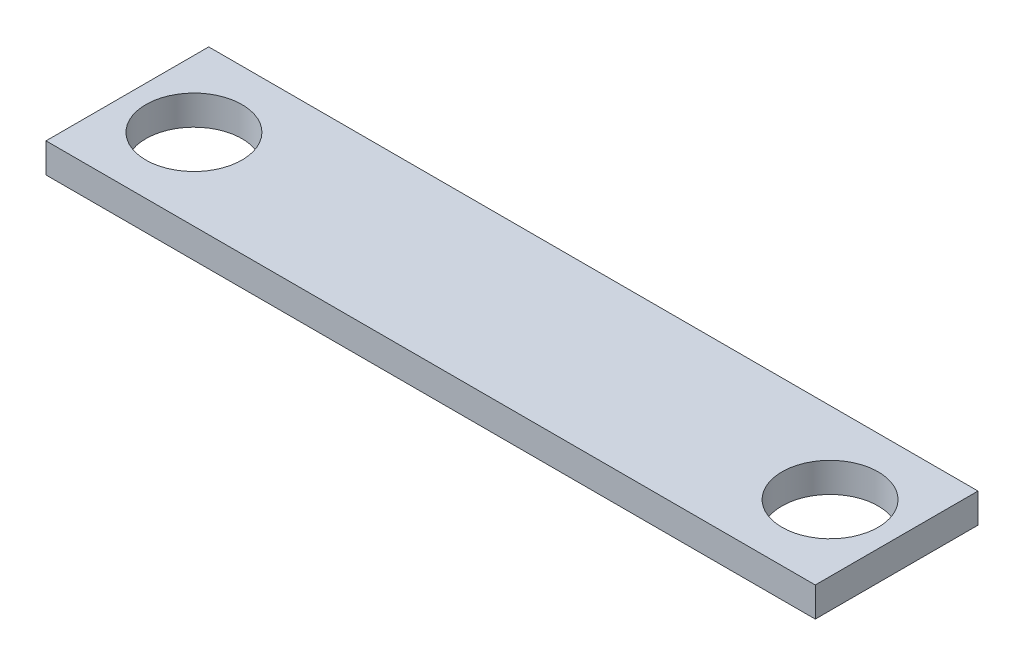
ISO-10303-21;
HEADER;
FILE_DESCRIPTION(('STEP AP214'),'2;1');
FILE_NAME('part.step','',(''),(''),'','','');
FILE_SCHEMA(('AUTOMOTIVE_DESIGN { 1 0 10303 214 1 1 1 1 }'));
ENDSEC;
DATA;
#1=APPLICATION_CONTEXT('core data for automotive mechanical design processes');
#2=APPLICATION_PROTOCOL_DEFINITION('international standard','automotive_design',2000,#1);
#3=PRODUCT_CONTEXT('',#1,'mechanical');
#4=PRODUCT('Part','Part','',(#3));
#5=PRODUCT_RELATED_PRODUCT_CATEGORY('part','',(#4));
#6=PRODUCT_DEFINITION_FORMATION('','',#4);
#7=PRODUCT_DEFINITION_CONTEXT('part definition',#1,'design');
#8=PRODUCT_DEFINITION('design','',#6,#7);
#9=PRODUCT_DEFINITION_SHAPE('','',#8);
#10=(LENGTH_UNIT() NAMED_UNIT(*) SI_UNIT(.MILLI.,.METRE.));
#11=(NAMED_UNIT(*) PLANE_ANGLE_UNIT() SI_UNIT($,.RADIAN.));
#12=(NAMED_UNIT(*) SI_UNIT($,.STERADIAN.) SOLID_ANGLE_UNIT());
#13=UNCERTAINTY_MEASURE_WITH_UNIT(LENGTH_MEASURE(1.E-05),#10,'distance_accuracy_value','');
#14=(GEOMETRIC_REPRESENTATION_CONTEXT(3) GLOBAL_UNCERTAINTY_ASSIGNED_CONTEXT((#13)) GLOBAL_UNIT_ASSIGNED_CONTEXT((#10,
#11,#12)) REPRESENTATION_CONTEXT('',''));
#15=CARTESIAN_POINT('',(0.,0.,0.));
#16=DIRECTION('',(0.,0.,1.));
#17=DIRECTION('',(1.,0.,0.));
#18=AXIS2_PLACEMENT_3D('',#15,#16,#17);
#19=CARTESIAN_POINT('',(0.,20.,0.));
#20=DIRECTION('',(0.,-1.,0.));
#21=DIRECTION('',(0.,0.,-1.));
#22=AXIS2_PLACEMENT_3D('',#19,#20,#21);
#23=PLANE('',#22);
#24=DIRECTION('',(0.,0.,-1.));
#25=VECTOR('',#24,1.);
#26=CARTESIAN_POINT('',(260.,20.,55.));
#27=LINE('',#26,#25);
#28=CARTESIAN_POINT('',(260.,20.,55.));
#29=VERTEX_POINT('',#28);
#30=CARTESIAN_POINT('',(260.,20.,-55.));
#31=VERTEX_POINT('',#30);
#32=EDGE_CURVE('E89',#29,#31,#27,.T.);
#33=ORIENTED_EDGE('',*,*,#32,.T.);
#34=DIRECTION('',(-1.,0.,0.));
#35=VECTOR('',#34,1.);
#36=CARTESIAN_POINT('',(-260.,20.,-55.));
#37=LINE('',#36,#35);
#38=CARTESIAN_POINT('',(-260.,20.,-55.));
#39=VERTEX_POINT('',#38);
#40=EDGE_CURVE('E84',#31,#39,#37,.T.);
#41=ORIENTED_EDGE('',*,*,#40,.T.);
#42=DIRECTION('',(0.,0.,1.));
#43=VECTOR('',#42,1.);
#44=CARTESIAN_POINT('',(-260.,20.,55.));
#45=LINE('',#44,#43);
#46=CARTESIAN_POINT('',(-260.,20.,55.));
#47=VERTEX_POINT('',#46);
#48=EDGE_CURVE('E87',#39,#47,#45,.T.);
#49=ORIENTED_EDGE('',*,*,#48,.T.);
#50=DIRECTION('',(1.,0.,0.));
#51=VECTOR('',#50,1.);
#52=CARTESIAN_POINT('',(-260.,20.,55.));
#53=LINE('',#52,#51);
#54=EDGE_CURVE('E54',#47,#29,#53,.T.);
#55=ORIENTED_EDGE('',*,*,#54,.T.);
#56=EDGE_LOOP('',(#33,#41,#49,#55));
#57=FACE_BOUND('',#56,.T.);
#58=CARTESIAN_POINT('',(-215.,20.,0.));
#59=DIRECTION('',(0.,1.,0.));
#60=DIRECTION('',(0.,0.,1.));
#61=AXIS2_PLACEMENT_3D('',#58,#59,#60);
#62=CIRCLE('',#61,32.5);
#63=CARTESIAN_POINT('',(-215.,20.,32.5));
#64=VERTEX_POINT('',#63);
#65=EDGE_CURVE('E104',#64,#64,#62,.T.);
#66=ORIENTED_EDGE('',*,*,#65,.F.);
#67=EDGE_LOOP('',(#66));
#68=FACE_BOUND('',#67,.T.);
#69=CARTESIAN_POINT('',(215.,20.,0.));
#70=DIRECTION('',(0.,1.,0.));
#71=DIRECTION('',(0.,0.,1.));
#72=AXIS2_PLACEMENT_3D('',#69,#70,#71);
#73=CIRCLE('',#72,32.5);
#74=CARTESIAN_POINT('',(215.,20.,32.5));
#75=VERTEX_POINT('',#74);
#76=EDGE_CURVE('E119',#75,#75,#73,.T.);
#77=ORIENTED_EDGE('',*,*,#76,.F.);
#78=EDGE_LOOP('',(#77));
#79=FACE_BOUND('',#78,.T.);
#80=ADVANCED_FACE('F37',(#57,#68,#79),#23,.F.);
#81=CARTESIAN_POINT('',(0.,0.,0.));
#82=DIRECTION('',(0.,-1.,0.));
#83=DIRECTION('',(0.,0.,-1.));
#84=AXIS2_PLACEMENT_3D('',#81,#82,#83);
#85=PLANE('',#84);
#86=CARTESIAN_POINT('',(-215.,0.,0.));
#87=DIRECTION('',(0.,1.,0.));
#88=DIRECTION('',(0.,0.,1.));
#89=AXIS2_PLACEMENT_3D('',#86,#87,#88);
#90=CIRCLE('',#89,32.5);
#91=CARTESIAN_POINT('',(-215.,0.,32.5));
#92=VERTEX_POINT('',#91);
#93=EDGE_CURVE('E116',#92,#92,#90,.T.);
#94=ORIENTED_EDGE('',*,*,#93,.T.);
#95=EDGE_LOOP('',(#94));
#96=FACE_BOUND('',#95,.T.);
#97=DIRECTION('',(0.,0.,-1.));
#98=VECTOR('',#97,1.);
#99=CARTESIAN_POINT('',(260.,0.,55.));
#100=LINE('',#99,#98);
#101=CARTESIAN_POINT('',(260.,0.,55.));
#102=VERTEX_POINT('',#101);
#103=CARTESIAN_POINT('',(260.,0.,-55.));
#104=VERTEX_POINT('',#103);
#105=EDGE_CURVE('E101',#102,#104,#100,.T.);
#106=ORIENTED_EDGE('',*,*,#105,.F.);
#107=DIRECTION('',(1.,0.,0.));
#108=VECTOR('',#107,1.);
#109=CARTESIAN_POINT('',(-260.,0.,55.));
#110=LINE('',#109,#108);
#111=CARTESIAN_POINT('',(-260.,0.,55.));
#112=VERTEX_POINT('',#111);
#113=EDGE_CURVE('E77',#112,#102,#110,.T.);
#114=ORIENTED_EDGE('',*,*,#113,.F.);
#115=DIRECTION('',(0.,0.,1.));
#116=VECTOR('',#115,1.);
#117=CARTESIAN_POINT('',(-260.,0.,55.));
#118=LINE('',#117,#116);
#119=CARTESIAN_POINT('',(-260.,0.,-55.));
#120=VERTEX_POINT('',#119);
#121=EDGE_CURVE('E71',#120,#112,#118,.T.);
#122=ORIENTED_EDGE('',*,*,#121,.F.);
#123=DIRECTION('',(-1.,0.,0.));
#124=VECTOR('',#123,1.);
#125=CARTESIAN_POINT('',(-260.,0.,-55.));
#126=LINE('',#125,#124);
#127=EDGE_CURVE('E93',#104,#120,#126,.T.);
#128=ORIENTED_EDGE('',*,*,#127,.F.);
#129=EDGE_LOOP('',(#106,#114,#122,#128));
#130=FACE_BOUND('',#129,.T.);
#131=CARTESIAN_POINT('',(215.,0.,0.));
#132=DIRECTION('',(0.,1.,0.));
#133=DIRECTION('',(0.,0.,1.));
#134=AXIS2_PLACEMENT_3D('',#131,#132,#133);
#135=CIRCLE('',#134,32.5);
#136=CARTESIAN_POINT('',(215.,0.,32.5));
#137=VERTEX_POINT('',#136);
#138=EDGE_CURVE('E122',#137,#137,#135,.T.);
#139=ORIENTED_EDGE('',*,*,#138,.T.);
#140=EDGE_LOOP('',(#139));
#141=FACE_BOUND('',#140,.T.);
#142=ADVANCED_FACE('F112',(#96,#130,#141),#85,.T.);
#143=CARTESIAN_POINT('',(260.,20.,55.));
#144=DIRECTION('',(-1.,0.,0.));
#145=DIRECTION('',(0.,0.,1.));
#146=AXIS2_PLACEMENT_3D('',#143,#144,#145);
#147=PLANE('',#146);
#148=ORIENTED_EDGE('',*,*,#105,.T.);
#149=DIRECTION('',(0.,-1.,0.));
#150=VECTOR('',#149,1.);
#151=CARTESIAN_POINT('',(260.,20.,-55.));
#152=LINE('',#151,#150);
#153=EDGE_CURVE('E11',#31,#104,#152,.T.);
#154=ORIENTED_EDGE('',*,*,#153,.F.);
#155=ORIENTED_EDGE('',*,*,#32,.F.);
#156=DIRECTION('',(0.,-1.,0.));
#157=VECTOR('',#156,1.);
#158=CARTESIAN_POINT('',(260.,20.,55.));
#159=LINE('',#158,#157);
#160=EDGE_CURVE('E97',#29,#102,#159,.T.);
#161=ORIENTED_EDGE('',*,*,#160,.T.);
#162=EDGE_LOOP('',(#148,#154,#155,#161));
#163=FACE_BOUND('',#162,.T.);
#164=ADVANCED_FACE('F39',(#163),#147,.F.);
#165=CARTESIAN_POINT('',(-260.,20.,-55.));
#166=DIRECTION('',(0.,0.,1.));
#167=DIRECTION('',(1.,0.,0.));
#168=AXIS2_PLACEMENT_3D('',#165,#166,#167);
#169=PLANE('',#168);
#170=ORIENTED_EDGE('',*,*,#127,.T.);
#171=DIRECTION('',(0.,-1.,0.));
#172=VECTOR('',#171,1.);
#173=CARTESIAN_POINT('',(-260.,20.,-55.));
#174=LINE('',#173,#172);
#175=EDGE_CURVE('E46',#39,#120,#174,.T.);
#176=ORIENTED_EDGE('',*,*,#175,.F.);
#177=ORIENTED_EDGE('',*,*,#40,.F.);
#178=ORIENTED_EDGE('',*,*,#153,.T.);
#179=EDGE_LOOP('',(#170,#176,#177,#178));
#180=FACE_BOUND('',#179,.T.);
#181=ADVANCED_FACE('F92',(#180),#169,.F.);
#182=CARTESIAN_POINT('',(-260.,20.,55.));
#183=DIRECTION('',(1.,0.,0.));
#184=DIRECTION('',(0.,0.,-1.));
#185=AXIS2_PLACEMENT_3D('',#182,#183,#184);
#186=PLANE('',#185);
#187=ORIENTED_EDGE('',*,*,#121,.T.);
#188=DIRECTION('',(0.,-1.,0.));
#189=VECTOR('',#188,1.);
#190=CARTESIAN_POINT('',(-260.,20.,55.));
#191=LINE('',#190,#189);
#192=EDGE_CURVE('E94',#47,#112,#191,.T.);
#193=ORIENTED_EDGE('',*,*,#192,.F.);
#194=ORIENTED_EDGE('',*,*,#48,.F.);
#195=ORIENTED_EDGE('',*,*,#175,.T.);
#196=EDGE_LOOP('',(#187,#193,#194,#195));
#197=FACE_BOUND('',#196,.T.);
#198=ADVANCED_FACE('F95',(#197),#186,.F.);
#199=CARTESIAN_POINT('',(-260.,20.,55.));
#200=DIRECTION('',(0.,0.,-1.));
#201=DIRECTION('',(-1.,0.,0.));
#202=AXIS2_PLACEMENT_3D('',#199,#200,#201);
#203=PLANE('',#202);
#204=ORIENTED_EDGE('',*,*,#113,.T.);
#205=ORIENTED_EDGE('',*,*,#160,.F.);
#206=ORIENTED_EDGE('',*,*,#54,.F.);
#207=ORIENTED_EDGE('',*,*,#192,.T.);
#208=EDGE_LOOP('',(#204,#205,#206,#207));
#209=FACE_BOUND('',#208,.T.);
#210=ADVANCED_FACE('F109',(#209),#203,.F.);
#211=CARTESIAN_POINT('',(-215.,20.,0.));
#212=DIRECTION('',(0.,-1.,0.));
#213=DIRECTION('',(0.,0.,-1.));
#214=AXIS2_PLACEMENT_3D('',#211,#212,#213);
#215=CYLINDRICAL_SURFACE('',#214,32.5);
#216=ORIENTED_EDGE('',*,*,#65,.T.);
#217=EDGE_LOOP('',(#216));
#218=FACE_BOUND('',#217,.T.);
#219=ORIENTED_EDGE('',*,*,#93,.F.);
#220=EDGE_LOOP('',(#219));
#221=FACE_BOUND('',#220,.T.);
#222=ADVANCED_FACE('F139',(#218,#221),#215,.F.);
#223=CARTESIAN_POINT('',(215.,20.,0.));
#224=DIRECTION('',(0.,-1.,0.));
#225=DIRECTION('',(0.,0.,-1.));
#226=AXIS2_PLACEMENT_3D('',#223,#224,#225);
#227=CYLINDRICAL_SURFACE('',#226,32.5);
#228=ORIENTED_EDGE('',*,*,#76,.T.);
#229=EDGE_LOOP('',(#228));
#230=FACE_BOUND('',#229,.T.);
#231=ORIENTED_EDGE('',*,*,#138,.F.);
#232=EDGE_LOOP('',(#231));
#233=FACE_BOUND('',#232,.T.);
#234=ADVANCED_FACE('F128',(#230,#233),#227,.F.);
#235=CLOSED_SHELL('',(#80,#142,#164,#181,#198,#210,#222,#234));
#236=MANIFOLD_SOLID_BREP('B2',#235);
#237=ADVANCED_BREP_SHAPE_REPRESENTATION('',(#18,#236),#14);
#238=SHAPE_DEFINITION_REPRESENTATION(#9,#237);
ENDSEC;
END-ISO-10303-21;
